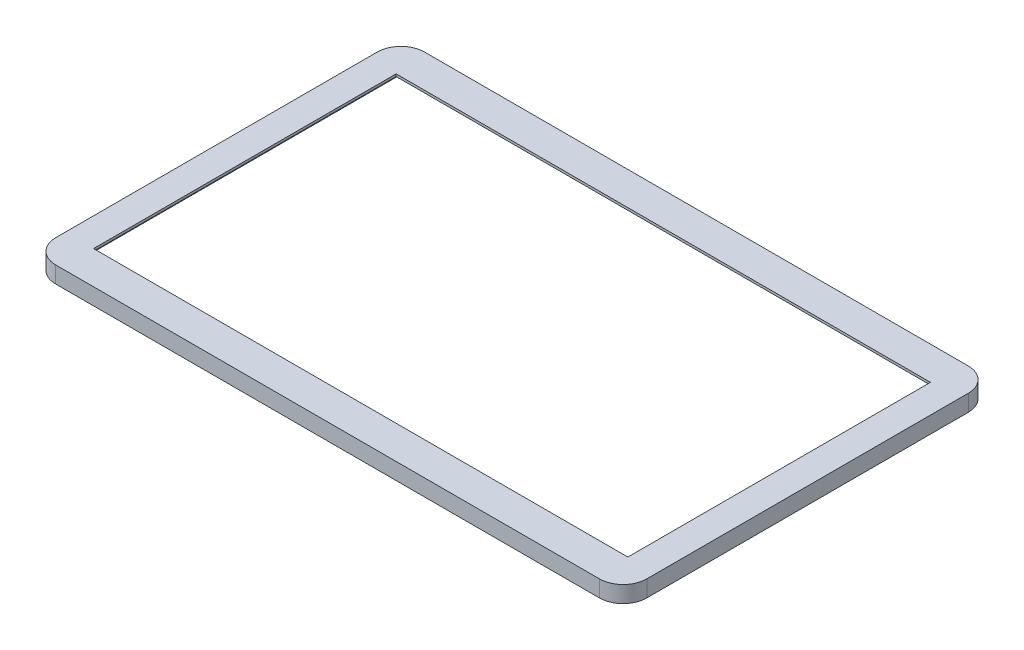
ISO-10303-21;
HEADER;
FILE_DESCRIPTION(('STEP AP214'),'2;1');
FILE_NAME('part.step','',(''),(''),'','','');
FILE_SCHEMA(('AUTOMOTIVE_DESIGN { 1 0 10303 214 1 1 1 1 }'));
ENDSEC;
DATA;
#1=APPLICATION_CONTEXT('core data for automotive mechanical design processes');
#2=APPLICATION_PROTOCOL_DEFINITION('international standard','automotive_design',2000,#1);
#3=PRODUCT_CONTEXT('',#1,'mechanical');
#4=PRODUCT('Part','Part','',(#3));
#5=PRODUCT_RELATED_PRODUCT_CATEGORY('part','',(#4));
#6=PRODUCT_DEFINITION_FORMATION('','',#4);
#7=PRODUCT_DEFINITION_CONTEXT('part definition',#1,'design');
#8=PRODUCT_DEFINITION('design','',#6,#7);
#9=PRODUCT_DEFINITION_SHAPE('','',#8);
#10=(LENGTH_UNIT() NAMED_UNIT(*) SI_UNIT(.MILLI.,.METRE.));
#11=(NAMED_UNIT(*) PLANE_ANGLE_UNIT() SI_UNIT($,.RADIAN.));
#12=(NAMED_UNIT(*) SI_UNIT($,.STERADIAN.) SOLID_ANGLE_UNIT());
#13=UNCERTAINTY_MEASURE_WITH_UNIT(LENGTH_MEASURE(1.E-05),#10,'distance_accuracy_value','');
#14=(GEOMETRIC_REPRESENTATION_CONTEXT(3) GLOBAL_UNCERTAINTY_ASSIGNED_CONTEXT((#13)) GLOBAL_UNIT_ASSIGNED_CONTEXT((#10,
#11,#12)) REPRESENTATION_CONTEXT('',''));
#15=CARTESIAN_POINT('',(0.,0.,0.));
#16=DIRECTION('',(0.,0.,1.));
#17=DIRECTION('',(1.,0.,0.));
#18=AXIS2_PLACEMENT_3D('',#15,#16,#17);
#19=CARTESIAN_POINT('',(-99.3406720741599,8.,-63.1019698725375));
#20=DIRECTION('',(1.,0.,0.));
#21=DIRECTION('',(0.,0.,-1.));
#22=AXIS2_PLACEMENT_3D('',#19,#20,#21);
#23=PLANE('',#22);
#24=DIRECTION('',(0.,0.,1.));
#25=VECTOR('',#24,1.);
#26=CARTESIAN_POINT('',(-99.3406720741599,7.,-63.1019698725375));
#27=LINE('',#26,#25);
#28=CARTESIAN_POINT('',(-99.3406720741599,7.,-53.1019698725375));
#29=VERTEX_POINT('',#28);
#30=CARTESIAN_POINT('',(-99.3406720741599,7.,82.8980301274624));
#31=VERTEX_POINT('',#30);
#32=EDGE_CURVE('E58',#29,#31,#27,.T.);
#33=ORIENTED_EDGE('',*,*,#32,.F.);
#34=DIRECTION('',(0.,1.,0.));
#35=VECTOR('',#34,1.);
#36=CARTESIAN_POINT('',(-99.3406720741599,-2.,-53.1019698725374));
#37=LINE('',#36,#35);
#38=CARTESIAN_POINT('',(-99.3406720741599,0.,-53.1019698725374));
#39=VERTEX_POINT('',#38);
#40=EDGE_CURVE('E160',#39,#29,#37,.T.);
#41=ORIENTED_EDGE('',*,*,#40,.F.);
#42=DIRECTION('',(0.,0.,1.));
#43=VECTOR('',#42,1.);
#44=CARTESIAN_POINT('',(-99.3406720741599,0.,-63.1019698725375));
#45=LINE('',#44,#43);
#46=CARTESIAN_POINT('',(-99.3406720741599,0.,82.8980301274624));
#47=VERTEX_POINT('',#46);
#48=EDGE_CURVE('E225',#39,#47,#45,.T.);
#49=ORIENTED_EDGE('',*,*,#48,.T.);
#50=DIRECTION('',(0.,1.,0.));
#51=VECTOR('',#50,1.);
#52=CARTESIAN_POINT('',(-99.3406720741599,-2.,82.8980301274624));
#53=LINE('',#52,#51);
#54=EDGE_CURVE('E162',#47,#31,#53,.T.);
#55=ORIENTED_EDGE('',*,*,#54,.T.);
#56=EDGE_LOOP('',(#33,#41,#49,#55));
#57=FACE_BOUND('',#56,.T.);
#58=ADVANCED_FACE('F37',(#57),#23,.F.);
#59=CARTESIAN_POINT('',(-99.3406720741599,8.,92.8980301274625));
#60=DIRECTION('',(0.,0.,-1.));
#61=DIRECTION('',(-1.,0.,0.));
#62=AXIS2_PLACEMENT_3D('',#59,#60,#61);
#63=PLANE('',#62);
#64=DIRECTION('',(1.,0.,0.));
#65=VECTOR('',#64,1.);
#66=CARTESIAN_POINT('',(-99.3406720741599,7.,92.8980301274625));
#67=LINE('',#66,#65);
#68=CARTESIAN_POINT('',(-89.3406720741599,7.,92.8980301274625));
#69=VERTEX_POINT('',#68);
#70=CARTESIAN_POINT('',(140.65932792584,7.,92.8980301274625));
#71=VERTEX_POINT('',#70);
#72=EDGE_CURVE('E163',#69,#71,#67,.T.);
#73=ORIENTED_EDGE('',*,*,#72,.F.);
#74=DIRECTION('',(0.,1.,0.));
#75=VECTOR('',#74,1.);
#76=CARTESIAN_POINT('',(-89.3406720741599,-2.,92.8980301274625));
#77=LINE('',#76,#75);
#78=CARTESIAN_POINT('',(-89.3406720741599,0.,92.8980301274625));
#79=VERTEX_POINT('',#78);
#80=EDGE_CURVE('E44',#69,#79,#77,.F.);
#81=ORIENTED_EDGE('',*,*,#80,.T.);
#82=DIRECTION('',(1.,0.,0.));
#83=VECTOR('',#82,1.);
#84=CARTESIAN_POINT('',(-99.3406720741599,0.,92.8980301274625));
#85=LINE('',#84,#83);
#86=CARTESIAN_POINT('',(140.65932792584,0.,92.8980301274625));
#87=VERTEX_POINT('',#86);
#88=EDGE_CURVE('E227',#79,#87,#85,.T.);
#89=ORIENTED_EDGE('',*,*,#88,.T.);
#90=DIRECTION('',(0.,1.,0.));
#91=VECTOR('',#90,1.);
#92=CARTESIAN_POINT('',(140.65932792584,-2.,92.8980301274625));
#93=LINE('',#92,#91);
#94=EDGE_CURVE('E267',#87,#71,#93,.T.);
#95=ORIENTED_EDGE('',*,*,#94,.T.);
#96=EDGE_LOOP('',(#73,#81,#89,#95));
#97=FACE_BOUND('',#96,.T.);
#98=ADVANCED_FACE('F248',(#97),#63,.F.);
#99=CARTESIAN_POINT('',(150.65932792584,8.,-63.1019698725375));
#100=DIRECTION('',(-1.,0.,0.));
#101=DIRECTION('',(0.,0.,1.));
#102=AXIS2_PLACEMENT_3D('',#99,#100,#101);
#103=PLANE('',#102);
#104=DIRECTION('',(0.,0.,-1.));
#105=VECTOR('',#104,1.);
#106=CARTESIAN_POINT('',(150.65932792584,7.,-63.1019698725375));
#107=LINE('',#106,#105);
#108=CARTESIAN_POINT('',(150.65932792584,7.,82.8980301274625));
#109=VERTEX_POINT('',#108);
#110=CARTESIAN_POINT('',(150.65932792584,7.,-53.1019698725375));
#111=VERTEX_POINT('',#110);
#112=EDGE_CURVE('E282',#109,#111,#107,.T.);
#113=ORIENTED_EDGE('',*,*,#112,.F.);
#114=DIRECTION('',(0.,1.,0.));
#115=VECTOR('',#114,1.);
#116=CARTESIAN_POINT('',(150.65932792584,-2.,82.8980301274625));
#117=LINE('',#116,#115);
#118=CARTESIAN_POINT('',(150.65932792584,0.,82.8980301274625));
#119=VERTEX_POINT('',#118);
#120=EDGE_CURVE('E243',#109,#119,#117,.F.);
#121=ORIENTED_EDGE('',*,*,#120,.T.);
#122=DIRECTION('',(0.,0.,-1.));
#123=VECTOR('',#122,1.);
#124=CARTESIAN_POINT('',(150.65932792584,0.,-63.1019698725375));
#125=LINE('',#124,#123);
#126=CARTESIAN_POINT('',(150.65932792584,0.,-53.1019698725374));
#127=VERTEX_POINT('',#126);
#128=EDGE_CURVE('E230',#119,#127,#125,.T.);
#129=ORIENTED_EDGE('',*,*,#128,.T.);
#130=DIRECTION('',(0.,1.,0.));
#131=VECTOR('',#130,1.);
#132=CARTESIAN_POINT('',(150.65932792584,-2.,-53.1019698725375));
#133=LINE('',#132,#131);
#134=EDGE_CURVE('E241',#111,#127,#133,.F.);
#135=ORIENTED_EDGE('',*,*,#134,.F.);
#136=EDGE_LOOP('',(#113,#121,#129,#135));
#137=FACE_BOUND('',#136,.T.);
#138=ADVANCED_FACE('F288',(#137),#103,.F.);
#139=CARTESIAN_POINT('',(-99.3406720741599,8.,-63.1019698725375));
#140=DIRECTION('',(0.,0.,1.));
#141=DIRECTION('',(1.,0.,0.));
#142=AXIS2_PLACEMENT_3D('',#139,#140,#141);
#143=PLANE('',#142);
#144=DIRECTION('',(-1.,0.,0.));
#145=VECTOR('',#144,1.);
#146=CARTESIAN_POINT('',(-99.3406720741599,7.,-63.1019698725375));
#147=LINE('',#146,#145);
#148=CARTESIAN_POINT('',(140.65932792584,7.,-63.1019698725375));
#149=VERTEX_POINT('',#148);
#150=CARTESIAN_POINT('',(-89.3406720741599,7.,-63.1019698725375));
#151=VERTEX_POINT('',#150);
#152=EDGE_CURVE('E149',#149,#151,#147,.T.);
#153=ORIENTED_EDGE('',*,*,#152,.F.);
#154=DIRECTION('',(0.,1.,0.));
#155=VECTOR('',#154,1.);
#156=CARTESIAN_POINT('',(140.65932792584,-2.,-63.1019698725375));
#157=LINE('',#156,#155);
#158=CARTESIAN_POINT('',(140.65932792584,0.,-63.1019698725375));
#159=VERTEX_POINT('',#158);
#160=EDGE_CURVE('E264',#159,#149,#157,.T.);
#161=ORIENTED_EDGE('',*,*,#160,.F.);
#162=DIRECTION('',(-1.,0.,0.));
#163=VECTOR('',#162,1.);
#164=CARTESIAN_POINT('',(-99.3406720741599,0.,-63.1019698725375));
#165=LINE('',#164,#163);
#166=CARTESIAN_POINT('',(-89.3406720741599,0.,-63.1019698725375));
#167=VERTEX_POINT('',#166);
#168=EDGE_CURVE('E233',#159,#167,#165,.T.);
#169=ORIENTED_EDGE('',*,*,#168,.T.);
#170=DIRECTION('',(0.,1.,0.));
#171=VECTOR('',#170,1.);
#172=CARTESIAN_POINT('',(-89.3406720741599,-2.,-63.1019698725375));
#173=LINE('',#172,#171);
#174=EDGE_CURVE('E239',#151,#167,#173,.F.);
#175=ORIENTED_EDGE('',*,*,#174,.F.);
#176=EDGE_LOOP('',(#153,#161,#169,#175));
#177=FACE_BOUND('',#176,.T.);
#178=ADVANCED_FACE('F296',(#177),#143,.F.);
#179=CARTESIAN_POINT('',(-87.3406720741599,8.,-49.1019698725375));
#180=DIRECTION('',(1.,0.,0.));
#181=DIRECTION('',(0.,0.,-1.));
#182=AXIS2_PLACEMENT_3D('',#179,#180,#181);
#183=PLANE('',#182);
#184=DIRECTION('',(0.,-1.,0.));
#185=VECTOR('',#184,1.);
#186=CARTESIAN_POINT('',(-87.3406720741599,8.,-49.1019698725375));
#187=LINE('',#186,#185);
#188=CARTESIAN_POINT('',(-87.3406720741599,7.,-49.1019698725375));
#189=VERTEX_POINT('',#188);
#190=CARTESIAN_POINT('',(-87.3406720741599,6.,-49.1019698725375));
#191=VERTEX_POINT('',#190);
#192=EDGE_CURVE('E217',#189,#191,#187,.T.);
#193=ORIENTED_EDGE('',*,*,#192,.F.);
#194=DIRECTION('',(0.,0.,1.));
#195=VECTOR('',#194,1.);
#196=CARTESIAN_POINT('',(-87.3406720741599,7.,-49.1019698725375));
#197=LINE('',#196,#195);
#198=CARTESIAN_POINT('',(-87.3406720741599,7.,78.8980301274625));
#199=VERTEX_POINT('',#198);
#200=EDGE_CURVE('E51',#189,#199,#197,.T.);
#201=ORIENTED_EDGE('',*,*,#200,.T.);
#202=DIRECTION('',(0.,-1.,0.));
#203=VECTOR('',#202,1.);
#204=CARTESIAN_POINT('',(-87.3406720741599,8.,78.8980301274625));
#205=LINE('',#204,#203);
#206=CARTESIAN_POINT('',(-87.3406720741599,6.,78.8980301274625));
#207=VERTEX_POINT('',#206);
#208=EDGE_CURVE('E223',#199,#207,#205,.T.);
#209=ORIENTED_EDGE('',*,*,#208,.T.);
#210=DIRECTION('',(0.,0.,-1.));
#211=VECTOR('',#210,1.);
#212=CARTESIAN_POINT('',(-87.3406720741599,6.,-49.1019698725375));
#213=LINE('',#212,#211);
#214=EDGE_CURVE('E214',#207,#191,#213,.T.);
#215=ORIENTED_EDGE('',*,*,#214,.T.);
#216=EDGE_LOOP('',(#193,#201,#209,#215));
#217=FACE_BOUND('',#216,.T.);
#218=ADVANCED_FACE('F298',(#217),#183,.T.);
#219=CARTESIAN_POINT('',(-87.3406720741599,8.,78.8980301274625));
#220=DIRECTION('',(0.,0.,-1.));
#221=DIRECTION('',(-1.,0.,0.));
#222=AXIS2_PLACEMENT_3D('',#219,#220,#221);
#223=PLANE('',#222);
#224=ORIENTED_EDGE('',*,*,#208,.F.);
#225=DIRECTION('',(1.,0.,0.));
#226=VECTOR('',#225,1.);
#227=CARTESIAN_POINT('',(-87.3406720741599,7.,78.8980301274625));
#228=LINE('',#227,#226);
#229=CARTESIAN_POINT('',(138.65932792584,7.,78.8980301274625));
#230=VERTEX_POINT('',#229);
#231=EDGE_CURVE('E271',#199,#230,#228,.T.);
#232=ORIENTED_EDGE('',*,*,#231,.T.);
#233=DIRECTION('',(0.,-1.,0.));
#234=VECTOR('',#233,1.);
#235=CARTESIAN_POINT('',(138.65932792584,8.,78.8980301274625));
#236=LINE('',#235,#234);
#237=CARTESIAN_POINT('',(138.65932792584,6.,78.8980301274625));
#238=VERTEX_POINT('',#237);
#239=EDGE_CURVE('E221',#230,#238,#236,.T.);
#240=ORIENTED_EDGE('',*,*,#239,.T.);
#241=DIRECTION('',(-1.,0.,0.));
#242=VECTOR('',#241,1.);
#243=CARTESIAN_POINT('',(-87.3406720741599,6.,78.8980301274625));
#244=LINE('',#243,#242);
#245=EDGE_CURVE('E211',#238,#207,#244,.T.);
#246=ORIENTED_EDGE('',*,*,#245,.T.);
#247=EDGE_LOOP('',(#224,#232,#240,#246));
#248=FACE_BOUND('',#247,.T.);
#249=ADVANCED_FACE('F304',(#248),#223,.T.);
#250=CARTESIAN_POINT('',(138.65932792584,8.,-49.1019698725375));
#251=DIRECTION('',(-1.,0.,0.));
#252=DIRECTION('',(0.,0.,1.));
#253=AXIS2_PLACEMENT_3D('',#250,#251,#252);
#254=PLANE('',#253);
#255=ORIENTED_EDGE('',*,*,#239,.F.);
#256=DIRECTION('',(0.,0.,-1.));
#257=VECTOR('',#256,1.);
#258=CARTESIAN_POINT('',(138.65932792584,7.,-49.1019698725375));
#259=LINE('',#258,#257);
#260=CARTESIAN_POINT('',(138.65932792584,7.,-49.1019698725375));
#261=VERTEX_POINT('',#260);
#262=EDGE_CURVE('E274',#230,#261,#259,.T.);
#263=ORIENTED_EDGE('',*,*,#262,.T.);
#264=DIRECTION('',(0.,-1.,0.));
#265=VECTOR('',#264,1.);
#266=CARTESIAN_POINT('',(138.65932792584,8.,-49.1019698725375));
#267=LINE('',#266,#265);
#268=CARTESIAN_POINT('',(138.65932792584,6.,-49.1019698725375));
#269=VERTEX_POINT('',#268);
#270=EDGE_CURVE('E219',#261,#269,#267,.T.);
#271=ORIENTED_EDGE('',*,*,#270,.T.);
#272=DIRECTION('',(0.,0.,1.));
#273=VECTOR('',#272,1.);
#274=CARTESIAN_POINT('',(138.65932792584,6.,-49.1019698725375));
#275=LINE('',#274,#273);
#276=EDGE_CURVE('E202',#269,#238,#275,.T.);
#277=ORIENTED_EDGE('',*,*,#276,.T.);
#278=EDGE_LOOP('',(#255,#263,#271,#277));
#279=FACE_BOUND('',#278,.T.);
#280=ADVANCED_FACE('F338',(#279),#254,.T.);
#281=CARTESIAN_POINT('',(-87.3406720741599,8.,-49.1019698725375));
#282=DIRECTION('',(0.,0.,1.));
#283=DIRECTION('',(1.,0.,0.));
#284=AXIS2_PLACEMENT_3D('',#281,#282,#283);
#285=PLANE('',#284);
#286=ORIENTED_EDGE('',*,*,#270,.F.);
#287=DIRECTION('',(-1.,0.,0.));
#288=VECTOR('',#287,1.);
#289=CARTESIAN_POINT('',(-87.3406720741599,7.,-49.1019698725375));
#290=LINE('',#289,#288);
#291=EDGE_CURVE('E153',#261,#189,#290,.T.);
#292=ORIENTED_EDGE('',*,*,#291,.T.);
#293=ORIENTED_EDGE('',*,*,#192,.T.);
#294=DIRECTION('',(1.,0.,0.));
#295=VECTOR('',#294,1.);
#296=CARTESIAN_POINT('',(-87.3406720741599,6.,-49.1019698725375));
#297=LINE('',#296,#295);
#298=EDGE_CURVE('E236',#191,#269,#297,.T.);
#299=ORIENTED_EDGE('',*,*,#298,.T.);
#300=EDGE_LOOP('',(#286,#292,#293,#299));
#301=FACE_BOUND('',#300,.T.);
#302=ADVANCED_FACE('F348',(#301),#285,.T.);
#303=CARTESIAN_POINT('',(-89.3406720741599,-2.,-53.1019698725375));
#304=DIRECTION('',(0.,1.,0.));
#305=DIRECTION('',(0.,0.,1.));
#306=AXIS2_PLACEMENT_3D('',#303,#304,#305);
#307=CYLINDRICAL_SURFACE('',#306,9.99999999999999);
#308=CARTESIAN_POINT('',(-89.3406720741599,7.,-53.1019698725375));
#309=DIRECTION('',(0.,1.,0.));
#310=DIRECTION('',(0.,0.,1.));
#311=AXIS2_PLACEMENT_3D('',#308,#309,#310);
#312=CIRCLE('',#311,9.99999999999999);
#313=EDGE_CURVE('E146',#151,#29,#312,.T.);
#314=ORIENTED_EDGE('',*,*,#313,.F.);
#315=ORIENTED_EDGE('',*,*,#174,.T.);
#316=CARTESIAN_POINT('',(-89.3406720741599,0.,-53.1019698725375));
#317=DIRECTION('',(0.,1.,0.));
#318=DIRECTION('',(0.,0.,1.));
#319=AXIS2_PLACEMENT_3D('',#316,#317,#318);
#320=CIRCLE('',#319,9.99999999999999);
#321=EDGE_CURVE('E167',#39,#167,#320,.F.);
#322=ORIENTED_EDGE('',*,*,#321,.F.);
#323=ORIENTED_EDGE('',*,*,#40,.T.);
#324=EDGE_LOOP('',(#314,#315,#322,#323));
#325=FACE_BOUND('',#324,.T.);
#326=ADVANCED_FACE('F165',(#325),#307,.T.);
#327=CARTESIAN_POINT('',(140.65932792584,-2.,-53.1019698725375));
#328=DIRECTION('',(0.,1.,0.));
#329=DIRECTION('',(0.,0.,1.));
#330=AXIS2_PLACEMENT_3D('',#327,#328,#329);
#331=CYLINDRICAL_SURFACE('',#330,10.);
#332=CARTESIAN_POINT('',(140.65932792584,7.,-53.1019698725375));
#333=DIRECTION('',(0.,1.,0.));
#334=DIRECTION('',(0.,0.,1.));
#335=AXIS2_PLACEMENT_3D('',#332,#333,#334);
#336=CIRCLE('',#335,10.);
#337=EDGE_CURVE('E154',#111,#149,#336,.T.);
#338=ORIENTED_EDGE('',*,*,#337,.F.);
#339=ORIENTED_EDGE('',*,*,#134,.T.);
#340=CARTESIAN_POINT('',(140.65932792584,0.,-53.1019698725375));
#341=DIRECTION('',(0.,1.,0.));
#342=DIRECTION('',(0.,0.,1.));
#343=AXIS2_PLACEMENT_3D('',#340,#341,#342);
#344=CIRCLE('',#343,10.);
#345=EDGE_CURVE('E261',#159,#127,#344,.F.);
#346=ORIENTED_EDGE('',*,*,#345,.F.);
#347=ORIENTED_EDGE('',*,*,#160,.T.);
#348=EDGE_LOOP('',(#338,#339,#346,#347));
#349=FACE_BOUND('',#348,.T.);
#350=ADVANCED_FACE('F292',(#349),#331,.T.);
#351=CARTESIAN_POINT('',(140.65932792584,-2.,82.8980301274625));
#352=DIRECTION('',(0.,1.,0.));
#353=DIRECTION('',(0.,0.,1.));
#354=AXIS2_PLACEMENT_3D('',#351,#352,#353);
#355=CYLINDRICAL_SURFACE('',#354,10.);
#356=CARTESIAN_POINT('',(140.65932792584,7.,82.8980301274625));
#357=DIRECTION('',(0.,1.,0.));
#358=DIRECTION('',(0.,0.,1.));
#359=AXIS2_PLACEMENT_3D('',#356,#357,#358);
#360=CIRCLE('',#359,10.);
#361=EDGE_CURVE('E279',#71,#109,#360,.T.);
#362=ORIENTED_EDGE('',*,*,#361,.F.);
#363=ORIENTED_EDGE('',*,*,#94,.F.);
#364=CARTESIAN_POINT('',(140.65932792584,0.,82.8980301274625));
#365=DIRECTION('',(0.,1.,0.));
#366=DIRECTION('',(0.,0.,1.));
#367=AXIS2_PLACEMENT_3D('',#364,#365,#366);
#368=CIRCLE('',#367,10.);
#369=EDGE_CURVE('E173',#119,#87,#368,.F.);
#370=ORIENTED_EDGE('',*,*,#369,.F.);
#371=ORIENTED_EDGE('',*,*,#120,.F.);
#372=EDGE_LOOP('',(#362,#363,#370,#371));
#373=FACE_BOUND('',#372,.T.);
#374=ADVANCED_FACE('F286',(#373),#355,.T.);
#375=CARTESIAN_POINT('',(-89.3406720741599,-2.,82.8980301274625));
#376=DIRECTION('',(0.,1.,0.));
#377=DIRECTION('',(0.,0.,1.));
#378=AXIS2_PLACEMENT_3D('',#375,#376,#377);
#379=CYLINDRICAL_SURFACE('',#378,9.99999999999999);
#380=CARTESIAN_POINT('',(-89.3406720741599,7.,82.8980301274625));
#381=DIRECTION('',(0.,1.,0.));
#382=DIRECTION('',(0.,0.,1.));
#383=AXIS2_PLACEMENT_3D('',#380,#381,#382);
#384=CIRCLE('',#383,9.99999999999999);
#385=EDGE_CURVE('E11',#31,#69,#384,.T.);
#386=ORIENTED_EDGE('',*,*,#385,.F.);
#387=ORIENTED_EDGE('',*,*,#54,.F.);
#388=CARTESIAN_POINT('',(-89.3406720741599,0.,82.8980301274625));
#389=DIRECTION('',(0.,1.,0.));
#390=DIRECTION('',(0.,0.,1.));
#391=AXIS2_PLACEMENT_3D('',#388,#389,#390);
#392=CIRCLE('',#391,9.99999999999999);
#393=EDGE_CURVE('E168',#79,#47,#392,.F.);
#394=ORIENTED_EDGE('',*,*,#393,.F.);
#395=ORIENTED_EDGE('',*,*,#80,.F.);
#396=EDGE_LOOP('',(#386,#387,#394,#395));
#397=FACE_BOUND('',#396,.T.);
#398=ADVANCED_FACE('F252',(#397),#379,.T.);
#399=CARTESIAN_POINT('',(0.,0.,0.));
#400=DIRECTION('',(0.,1.,0.));
#401=DIRECTION('',(0.,0.,1.));
#402=AXIS2_PLACEMENT_3D('',#399,#400,#401);
#403=PLANE('',#402);
#404=DIRECTION('',(1.,0.,0.));
#405=VECTOR('',#404,1.);
#406=CARTESIAN_POINT('',(-93.0906720741599,0.,-56.8519698725375));
#407=LINE('',#406,#405);
#408=CARTESIAN_POINT('',(-93.0906720741599,0.,-56.8519698725375));
#409=VERTEX_POINT('',#408);
#410=CARTESIAN_POINT('',(142.40932792584,0.,-56.8519698725375));
#411=VERTEX_POINT('',#410);
#412=EDGE_CURVE('E192',#409,#411,#407,.T.);
#413=ORIENTED_EDGE('',*,*,#412,.F.);
#414=DIRECTION('',(0.,0.,-1.));
#415=VECTOR('',#414,1.);
#416=CARTESIAN_POINT('',(-93.0906720741599,0.,82.6480301274625));
#417=LINE('',#416,#415);
#418=CARTESIAN_POINT('',(-93.0906720741599,0.,82.6480301274625));
#419=VERTEX_POINT('',#418);
#420=EDGE_CURVE('E170',#419,#409,#417,.T.);
#421=ORIENTED_EDGE('',*,*,#420,.F.);
#422=DIRECTION('',(-1.,0.,0.));
#423=VECTOR('',#422,1.);
#424=CARTESIAN_POINT('',(-93.0906720741599,0.,82.6480301274625));
#425=LINE('',#424,#423);
#426=CARTESIAN_POINT('',(142.40932792584,0.,82.6480301274625));
#427=VERTEX_POINT('',#426);
#428=EDGE_CURVE('E181',#427,#419,#425,.T.);
#429=ORIENTED_EDGE('',*,*,#428,.F.);
#430=DIRECTION('',(0.,0.,1.));
#431=VECTOR('',#430,1.);
#432=CARTESIAN_POINT('',(142.40932792584,0.,82.6480301274625));
#433=LINE('',#432,#431);
#434=EDGE_CURVE('E195',#411,#427,#433,.T.);
#435=ORIENTED_EDGE('',*,*,#434,.F.);
#436=EDGE_LOOP('',(#413,#421,#429,#435));
#437=FACE_BOUND('',#436,.T.);
#438=ORIENTED_EDGE('',*,*,#88,.F.);
#439=ORIENTED_EDGE('',*,*,#393,.T.);
#440=ORIENTED_EDGE('',*,*,#48,.F.);
#441=ORIENTED_EDGE('',*,*,#321,.T.);
#442=ORIENTED_EDGE('',*,*,#168,.F.);
#443=ORIENTED_EDGE('',*,*,#345,.T.);
#444=ORIENTED_EDGE('',*,*,#128,.F.);
#445=ORIENTED_EDGE('',*,*,#369,.T.);
#446=EDGE_LOOP('',(#438,#439,#440,#441,#442,#443,#444,#445));
#447=FACE_BOUND('',#446,.T.);
#448=ADVANCED_FACE('F255',(#437,#447),#403,.F.);
#449=CARTESIAN_POINT('',(-93.0906720741599,6.,82.6480301274625));
#450=DIRECTION('',(-1.,0.,0.));
#451=DIRECTION('',(0.,0.,1.));
#452=AXIS2_PLACEMENT_3D('',#449,#450,#451);
#453=PLANE('',#452);
#454=ORIENTED_EDGE('',*,*,#420,.T.);
#455=DIRECTION('',(0.,-1.,0.));
#456=VECTOR('',#455,1.);
#457=CARTESIAN_POINT('',(-93.0906720741599,6.,-56.8519698725375));
#458=LINE('',#457,#456);
#459=CARTESIAN_POINT('',(-93.0906720741599,6.,-56.8519698725375));
#460=VERTEX_POINT('',#459);
#461=EDGE_CURVE('E190',#460,#409,#458,.T.);
#462=ORIENTED_EDGE('',*,*,#461,.F.);
#463=DIRECTION('',(0.,0.,-1.));
#464=VECTOR('',#463,1.);
#465=CARTESIAN_POINT('',(-93.0906720741599,6.,82.6480301274625));
#466=LINE('',#465,#464);
#467=CARTESIAN_POINT('',(-93.0906720741599,6.,82.6480301274625));
#468=VERTEX_POINT('',#467);
#469=EDGE_CURVE('E177',#468,#460,#466,.T.);
#470=ORIENTED_EDGE('',*,*,#469,.F.);
#471=DIRECTION('',(0.,-1.,0.));
#472=VECTOR('',#471,1.);
#473=CARTESIAN_POINT('',(-93.0906720741599,6.,82.6480301274625));
#474=LINE('',#473,#472);
#475=EDGE_CURVE('E200',#468,#419,#474,.T.);
#476=ORIENTED_EDGE('',*,*,#475,.T.);
#477=EDGE_LOOP('',(#454,#462,#470,#476));
#478=FACE_BOUND('',#477,.T.);
#479=ADVANCED_FACE('F435',(#478),#453,.F.);
#480=CARTESIAN_POINT('',(-93.0906720741599,6.,82.6480301274625));
#481=DIRECTION('',(0.,0.,1.));
#482=DIRECTION('',(1.,0.,0.));
#483=AXIS2_PLACEMENT_3D('',#480,#481,#482);
#484=PLANE('',#483);
#485=ORIENTED_EDGE('',*,*,#428,.T.);
#486=ORIENTED_EDGE('',*,*,#475,.F.);
#487=DIRECTION('',(-1.,0.,0.));
#488=VECTOR('',#487,1.);
#489=CARTESIAN_POINT('',(-93.0906720741599,6.,82.6480301274625));
#490=LINE('',#489,#488);
#491=CARTESIAN_POINT('',(142.40932792584,6.,82.6480301274625));
#492=VERTEX_POINT('',#491);
#493=EDGE_CURVE('E187',#492,#468,#490,.T.);
#494=ORIENTED_EDGE('',*,*,#493,.F.);
#495=DIRECTION('',(0.,-1.,0.));
#496=VECTOR('',#495,1.);
#497=CARTESIAN_POINT('',(142.40932792584,6.,82.6480301274625));
#498=LINE('',#497,#496);
#499=EDGE_CURVE('E203',#492,#427,#498,.T.);
#500=ORIENTED_EDGE('',*,*,#499,.T.);
#501=EDGE_LOOP('',(#485,#486,#494,#500));
#502=FACE_BOUND('',#501,.T.);
#503=ADVANCED_FACE('F427',(#502),#484,.F.);
#504=CARTESIAN_POINT('',(142.40932792584,6.,82.6480301274625));
#505=DIRECTION('',(1.,0.,0.));
#506=DIRECTION('',(0.,0.,-1.));
#507=AXIS2_PLACEMENT_3D('',#504,#505,#506);
#508=PLANE('',#507);
#509=ORIENTED_EDGE('',*,*,#434,.T.);
#510=ORIENTED_EDGE('',*,*,#499,.F.);
#511=DIRECTION('',(0.,0.,1.));
#512=VECTOR('',#511,1.);
#513=CARTESIAN_POINT('',(142.40932792584,6.,82.6480301274625));
#514=LINE('',#513,#512);
#515=CARTESIAN_POINT('',(142.40932792584,6.,-56.8519698725375));
#516=VERTEX_POINT('',#515);
#517=EDGE_CURVE('E184',#516,#492,#514,.T.);
#518=ORIENTED_EDGE('',*,*,#517,.F.);
#519=DIRECTION('',(0.,-1.,0.));
#520=VECTOR('',#519,1.);
#521=CARTESIAN_POINT('',(142.40932792584,6.,-56.8519698725375));
#522=LINE('',#521,#520);
#523=EDGE_CURVE('E205',#516,#411,#522,.T.);
#524=ORIENTED_EDGE('',*,*,#523,.T.);
#525=EDGE_LOOP('',(#509,#510,#518,#524));
#526=FACE_BOUND('',#525,.T.);
#527=ADVANCED_FACE('F419',(#526),#508,.F.);
#528=CARTESIAN_POINT('',(-93.0906720741599,6.,-56.8519698725375));
#529=DIRECTION('',(0.,0.,-1.));
#530=DIRECTION('',(-1.,0.,0.));
#531=AXIS2_PLACEMENT_3D('',#528,#529,#530);
#532=PLANE('',#531);
#533=ORIENTED_EDGE('',*,*,#412,.T.);
#534=ORIENTED_EDGE('',*,*,#523,.F.);
#535=DIRECTION('',(1.,0.,0.));
#536=VECTOR('',#535,1.);
#537=CARTESIAN_POINT('',(-93.0906720741599,6.,-56.8519698725375));
#538=LINE('',#537,#536);
#539=EDGE_CURVE('E180',#460,#516,#538,.T.);
#540=ORIENTED_EDGE('',*,*,#539,.F.);
#541=ORIENTED_EDGE('',*,*,#461,.T.);
#542=EDGE_LOOP('',(#533,#534,#540,#541));
#543=FACE_BOUND('',#542,.T.);
#544=ADVANCED_FACE('F410',(#543),#532,.F.);
#545=CARTESIAN_POINT('',(0.,6.,0.));
#546=DIRECTION('',(0.,-1.,0.));
#547=DIRECTION('',(0.,0.,-1.));
#548=AXIS2_PLACEMENT_3D('',#545,#546,#547);
#549=PLANE('',#548);
#550=ORIENTED_EDGE('',*,*,#245,.F.);
#551=ORIENTED_EDGE('',*,*,#276,.F.);
#552=ORIENTED_EDGE('',*,*,#298,.F.);
#553=ORIENTED_EDGE('',*,*,#214,.F.);
#554=EDGE_LOOP('',(#550,#551,#552,#553));
#555=FACE_BOUND('',#554,.T.);
#556=ORIENTED_EDGE('',*,*,#469,.T.);
#557=ORIENTED_EDGE('',*,*,#539,.T.);
#558=ORIENTED_EDGE('',*,*,#517,.T.);
#559=ORIENTED_EDGE('',*,*,#493,.T.);
#560=EDGE_LOOP('',(#556,#557,#558,#559));
#561=FACE_BOUND('',#560,.T.);
#562=ADVANCED_FACE('F400',(#555,#561),#549,.T.);
#563=CARTESIAN_POINT('',(0.,7.,0.));
#564=DIRECTION('',(0.,1.,0.));
#565=DIRECTION('',(0.,0.,1.));
#566=AXIS2_PLACEMENT_3D('',#563,#564,#565);
#567=PLANE('',#566);
#568=ORIENTED_EDGE('',*,*,#291,.F.);
#569=ORIENTED_EDGE('',*,*,#262,.F.);
#570=ORIENTED_EDGE('',*,*,#231,.F.);
#571=ORIENTED_EDGE('',*,*,#200,.F.);
#572=EDGE_LOOP('',(#568,#569,#570,#571));
#573=FACE_BOUND('',#572,.T.);
#574=ORIENTED_EDGE('',*,*,#313,.T.);
#575=ORIENTED_EDGE('',*,*,#32,.T.);
#576=ORIENTED_EDGE('',*,*,#385,.T.);
#577=ORIENTED_EDGE('',*,*,#72,.T.);
#578=ORIENTED_EDGE('',*,*,#361,.T.);
#579=ORIENTED_EDGE('',*,*,#112,.T.);
#580=ORIENTED_EDGE('',*,*,#337,.T.);
#581=ORIENTED_EDGE('',*,*,#152,.T.);
#582=EDGE_LOOP('',(#574,#575,#576,#577,#578,#579,#580,#581));
#583=FACE_BOUND('',#582,.T.);
#584=ADVANCED_FACE('F147',(#573,#583),#567,.T.);
#585=CLOSED_SHELL('',(#58,#98,#138,#178,#218,#249,#280,#302,#326,#350,#374,#398,#448,#479,#503,
#527,#544,#562,#584));
#586=MANIFOLD_SOLID_BREP('B2',#585);
#587=ADVANCED_BREP_SHAPE_REPRESENTATION('',(#18,#586),#14);
#588=SHAPE_DEFINITION_REPRESENTATION(#9,#587);
ENDSEC;
END-ISO-10303-21;
